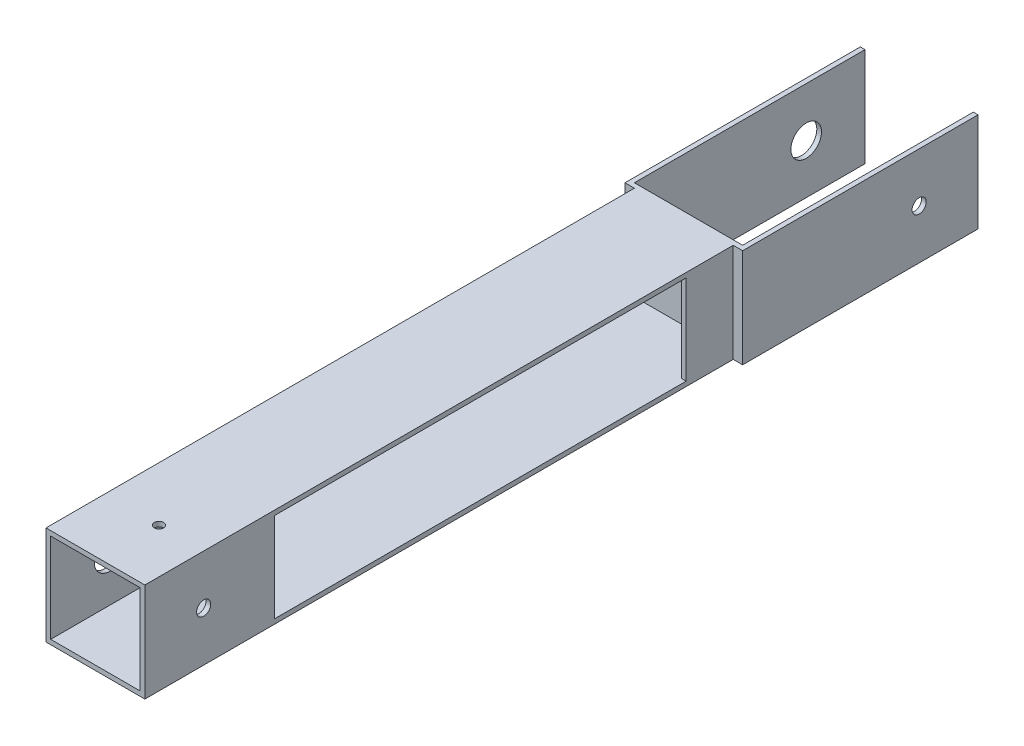
ISO-10303-21;
HEADER;
FILE_DESCRIPTION(('STEP AP214'),'2;1');
FILE_NAME('part.step','',(''),(''),'','','');
FILE_SCHEMA(('AUTOMOTIVE_DESIGN { 1 0 10303 214 1 1 1 1 }'));
ENDSEC;
DATA;
#1=APPLICATION_CONTEXT('core data for automotive mechanical design processes');
#2=APPLICATION_PROTOCOL_DEFINITION('international standard','automotive_design',2000,#1);
#3=PRODUCT_CONTEXT('',#1,'mechanical');
#4=PRODUCT('Part','Part','',(#3));
#5=PRODUCT_RELATED_PRODUCT_CATEGORY('part','',(#4));
#6=PRODUCT_DEFINITION_FORMATION('','',#4);
#7=PRODUCT_DEFINITION_CONTEXT('part definition',#1,'design');
#8=PRODUCT_DEFINITION('design','',#6,#7);
#9=PRODUCT_DEFINITION_SHAPE('','',#8);
#10=(LENGTH_UNIT() NAMED_UNIT(*) SI_UNIT(.MILLI.,.METRE.));
#11=(NAMED_UNIT(*) PLANE_ANGLE_UNIT() SI_UNIT($,.RADIAN.));
#12=(NAMED_UNIT(*) SI_UNIT($,.STERADIAN.) SOLID_ANGLE_UNIT());
#13=UNCERTAINTY_MEASURE_WITH_UNIT(LENGTH_MEASURE(1.E-05),#10,'distance_accuracy_value','');
#14=(GEOMETRIC_REPRESENTATION_CONTEXT(3) GLOBAL_UNCERTAINTY_ASSIGNED_CONTEXT((#13)) GLOBAL_UNIT_ASSIGNED_CONTEXT((#10,
#11,#12)) REPRESENTATION_CONTEXT('',''));
#15=CARTESIAN_POINT('',(0.,0.,0.));
#16=DIRECTION('',(0.,0.,1.));
#17=DIRECTION('',(1.,0.,0.));
#18=AXIS2_PLACEMENT_3D('',#15,#16,#17);
#19=CARTESIAN_POINT('',(19.,-19.,-250.));
#20=DIRECTION('',(1.,0.,0.));
#21=DIRECTION('',(0.,0.,-1.));
#22=AXIS2_PLACEMENT_3D('',#19,#20,#21);
#23=PLANE('',#22);
#24=CARTESIAN_POINT('',(19.,0.,-25.));
#25=DIRECTION('',(1.,0.,0.));
#26=DIRECTION('',(0.,0.,-1.));
#27=AXIS2_PLACEMENT_3D('',#24,#25,#26);
#28=CIRCLE('',#27,3.);
#29=CARTESIAN_POINT('',(19.,0.,-28.));
#30=VERTEX_POINT('',#29);
#31=EDGE_CURVE('E207',#30,#30,#28,.F.);
#32=ORIENTED_EDGE('',*,*,#31,.F.);
#33=EDGE_LOOP('',(#32));
#34=FACE_BOUND('',#33,.T.);
#35=DIRECTION('',(0.,0.,1.));
#36=VECTOR('',#35,1.);
#37=CARTESIAN_POINT('',(19.,19.,-250.));
#38=LINE('',#37,#36);
#39=CARTESIAN_POINT('',(19.,19.,-55.));
#40=VERTEX_POINT('',#39);
#41=CARTESIAN_POINT('',(19.,19.,0.));
#42=VERTEX_POINT('',#41);
#43=EDGE_CURVE('E299',#40,#42,#38,.T.);
#44=ORIENTED_EDGE('',*,*,#43,.F.);
#45=DIRECTION('',(0.,-1.,0.));
#46=VECTOR('',#45,1.);
#47=CARTESIAN_POINT('',(19.,-19.,-55.));
#48=LINE('',#47,#46);
#49=CARTESIAN_POINT('',(19.,-19.,-55.));
#50=VERTEX_POINT('',#49);
#51=EDGE_CURVE('E199',#40,#50,#48,.T.);
#52=ORIENTED_EDGE('',*,*,#51,.T.);
#53=DIRECTION('',(0.,0.,1.));
#54=VECTOR('',#53,1.);
#55=CARTESIAN_POINT('',(19.,-19.,-250.));
#56=LINE('',#55,#54);
#57=CARTESIAN_POINT('',(19.,-19.,0.));
#58=VERTEX_POINT('',#57);
#59=EDGE_CURVE('E313',#50,#58,#56,.T.);
#60=ORIENTED_EDGE('',*,*,#59,.T.);
#61=DIRECTION('',(0.,1.,0.));
#62=VECTOR('',#61,1.);
#63=CARTESIAN_POINT('',(19.,-19.,0.));
#64=LINE('',#63,#62);
#65=EDGE_CURVE('E285',#58,#42,#64,.T.);
#66=ORIENTED_EDGE('',*,*,#65,.T.);
#67=EDGE_LOOP('',(#44,#52,#60,#66));
#68=FACE_BOUND('',#67,.T.);
#69=ADVANCED_FACE('F33',(#34,#68),#23,.F.);
#70=CARTESIAN_POINT('',(21.,-21.0000000000001,-250.));
#71=DIRECTION('',(1.,0.,0.));
#72=DIRECTION('',(0.,0.,-1.));
#73=AXIS2_PLACEMENT_3D('',#70,#71,#72);
#74=PLANE('',#73);
#75=DIRECTION('',(0.,-1.,0.));
#76=VECTOR('',#75,1.);
#77=CARTESIAN_POINT('',(21.,-19.,-55.));
#78=LINE('',#77,#76);
#79=CARTESIAN_POINT('',(21.,19.,-55.));
#80=VERTEX_POINT('',#79);
#81=CARTESIAN_POINT('',(21.,-19.,-55.));
#82=VERTEX_POINT('',#81);
#83=EDGE_CURVE('E50',#80,#82,#78,.T.);
#84=ORIENTED_EDGE('',*,*,#83,.F.);
#85=DIRECTION('',(0.,0.,1.));
#86=VECTOR('',#85,1.);
#87=CARTESIAN_POINT('',(21.,19.,-230.));
#88=LINE('',#87,#86);
#89=CARTESIAN_POINT('',(21.,19.,-230.));
#90=VERTEX_POINT('',#89);
#91=EDGE_CURVE('E189',#90,#80,#88,.T.);
#92=ORIENTED_EDGE('',*,*,#91,.F.);
#93=DIRECTION('',(0.,1.,0.));
#94=VECTOR('',#93,1.);
#95=CARTESIAN_POINT('',(21.,-19.,-230.));
#96=LINE('',#95,#94);
#97=CARTESIAN_POINT('',(21.,-19.,-230.));
#98=VERTEX_POINT('',#97);
#99=EDGE_CURVE('E173',#98,#90,#96,.T.);
#100=ORIENTED_EDGE('',*,*,#99,.F.);
#101=DIRECTION('',(0.,0.,-1.));
#102=VECTOR('',#101,1.);
#103=CARTESIAN_POINT('',(21.,-19.,-230.));
#104=LINE('',#103,#102);
#105=EDGE_CURVE('E182',#82,#98,#104,.T.);
#106=ORIENTED_EDGE('',*,*,#105,.F.);
#107=EDGE_LOOP('',(#84,#92,#100,#106));
#108=FACE_BOUND('',#107,.T.);
#109=CARTESIAN_POINT('',(21.,0.,-25.));
#110=DIRECTION('',(1.,0.,0.));
#111=DIRECTION('',(0.,0.,-1.));
#112=AXIS2_PLACEMENT_3D('',#109,#110,#111);
#113=CIRCLE('',#112,3.);
#114=CARTESIAN_POINT('',(21.,0.,-28.));
#115=VERTEX_POINT('',#114);
#116=EDGE_CURVE('E202',#115,#115,#113,.F.);
#117=ORIENTED_EDGE('',*,*,#116,.T.);
#118=EDGE_LOOP('',(#117));
#119=FACE_BOUND('',#118,.T.);
#120=DIRECTION('',(0.,1.,0.));
#121=VECTOR('',#120,1.);
#122=CARTESIAN_POINT('',(21.,-21.0000000000001,0.));
#123=LINE('',#122,#121);
#124=CARTESIAN_POINT('',(21.,-21.0000000000001,0.));
#125=VERTEX_POINT('',#124);
#126=CARTESIAN_POINT('',(21.,21.0000000000001,0.));
#127=VERTEX_POINT('',#126);
#128=EDGE_CURVE('E312',#125,#127,#123,.T.);
#129=ORIENTED_EDGE('',*,*,#128,.F.);
#130=DIRECTION('',(0.,0.,1.));
#131=VECTOR('',#130,1.);
#132=CARTESIAN_POINT('',(21.,-21.0000000000001,-250.));
#133=LINE('',#132,#131);
#134=CARTESIAN_POINT('',(21.,-21.,-250.));
#135=VERTEX_POINT('',#134);
#136=EDGE_CURVE('E11',#135,#125,#133,.T.);
#137=ORIENTED_EDGE('',*,*,#136,.F.);
#138=DIRECTION('',(0.,1.,0.));
#139=VECTOR('',#138,1.);
#140=CARTESIAN_POINT('',(21.,-21.0000000000001,-250.));
#141=LINE('',#140,#139);
#142=CARTESIAN_POINT('',(21.,21.,-250.));
#143=VERTEX_POINT('',#142);
#144=EDGE_CURVE('E321',#135,#143,#141,.T.);
#145=ORIENTED_EDGE('',*,*,#144,.T.);
#146=DIRECTION('',(0.,0.,1.));
#147=VECTOR('',#146,1.);
#148=CARTESIAN_POINT('',(21.,21.0000000000001,-250.));
#149=LINE('',#148,#147);
#150=EDGE_CURVE('E328',#143,#127,#149,.T.);
#151=ORIENTED_EDGE('',*,*,#150,.T.);
#152=EDGE_LOOP('',(#129,#137,#145,#151));
#153=FACE_BOUND('',#152,.T.);
#154=ADVANCED_FACE('F35',(#108,#119,#153),#74,.T.);
#155=CARTESIAN_POINT('',(-21.,-21.0000000000001,-250.));
#156=DIRECTION('',(0.,-1.,0.));
#157=DIRECTION('',(0.,0.,-1.));
#158=AXIS2_PLACEMENT_3D('',#155,#156,#157);
#159=PLANE('',#158);
#160=CARTESIAN_POINT('',(2.,-21.0000000000001,-25.));
#161=DIRECTION('',(0.,1.,0.));
#162=DIRECTION('',(0.,0.,1.));
#163=AXIS2_PLACEMENT_3D('',#160,#161,#162);
#164=CIRCLE('',#163,2.);
#165=CARTESIAN_POINT('',(2.,-21.0000000000001,-23.));
#166=VERTEX_POINT('',#165);
#167=EDGE_CURVE('E454',#166,#166,#164,.T.);
#168=ORIENTED_EDGE('',*,*,#167,.T.);
#169=EDGE_LOOP('',(#168));
#170=FACE_BOUND('',#169,.T.);
#171=DIRECTION('',(1.,0.,0.));
#172=VECTOR('',#171,1.);
#173=CARTESIAN_POINT('',(-21.,-21.0000000000001,0.));
#174=LINE('',#173,#172);
#175=CARTESIAN_POINT('',(-21.,-21.0000000000001,0.));
#176=VERTEX_POINT('',#175);
#177=EDGE_CURVE('E325',#176,#125,#174,.T.);
#178=ORIENTED_EDGE('',*,*,#177,.F.);
#179=DIRECTION('',(0.,0.,1.));
#180=VECTOR('',#179,1.);
#181=CARTESIAN_POINT('',(-21.,-21.0000000000001,-250.));
#182=LINE('',#181,#180);
#183=CARTESIAN_POINT('',(-21.,-21.0000000000001,-250.));
#184=VERTEX_POINT('',#183);
#185=EDGE_CURVE('E42',#184,#176,#182,.T.);
#186=ORIENTED_EDGE('',*,*,#185,.F.);
#187=DIRECTION('',(1.,0.,0.));
#188=VECTOR('',#187,1.);
#189=CARTESIAN_POINT('',(25.,-21.,-250.));
#190=LINE('',#189,#188);
#191=CARTESIAN_POINT('',(-25.,-21.,-250.));
#192=VERTEX_POINT('',#191);
#193=EDGE_CURVE('E246',#192,#184,#190,.T.);
#194=ORIENTED_EDGE('',*,*,#193,.F.);
#195=DIRECTION('',(0.,0.,1.));
#196=VECTOR('',#195,1.);
#197=CARTESIAN_POINT('',(-25.,-21.,-250.));
#198=LINE('',#197,#196);
#199=CARTESIAN_POINT('',(-25.,-21.,-350.));
#200=VERTEX_POINT('',#199);
#201=EDGE_CURVE('E260',#200,#192,#198,.T.);
#202=ORIENTED_EDGE('',*,*,#201,.F.);
#203=DIRECTION('',(-1.,0.,0.));
#204=VECTOR('',#203,1.);
#205=CARTESIAN_POINT('',(-25.,-21.,-350.));
#206=LINE('',#205,#204);
#207=CARTESIAN_POINT('',(-23.,-21.,-350.));
#208=VERTEX_POINT('',#207);
#209=EDGE_CURVE('E258',#208,#200,#206,.T.);
#210=ORIENTED_EDGE('',*,*,#209,.F.);
#211=DIRECTION('',(0.,0.,-1.));
#212=VECTOR('',#211,1.);
#213=CARTESIAN_POINT('',(-23.,-21.,-350.));
#214=LINE('',#213,#212);
#215=CARTESIAN_POINT('',(-23.,-21.,-252.));
#216=VERTEX_POINT('',#215);
#217=EDGE_CURVE('E256',#216,#208,#214,.T.);
#218=ORIENTED_EDGE('',*,*,#217,.F.);
#219=DIRECTION('',(-1.,0.,0.));
#220=VECTOR('',#219,1.);
#221=CARTESIAN_POINT('',(-23.,-21.,-252.));
#222=LINE('',#221,#220);
#223=CARTESIAN_POINT('',(23.,-21.,-252.));
#224=VERTEX_POINT('',#223);
#225=EDGE_CURVE('E254',#224,#216,#222,.T.);
#226=ORIENTED_EDGE('',*,*,#225,.F.);
#227=DIRECTION('',(0.,0.,1.));
#228=VECTOR('',#227,1.);
#229=CARTESIAN_POINT('',(23.,-21.,-252.));
#230=LINE('',#229,#228);
#231=CARTESIAN_POINT('',(23.,-21.,-350.));
#232=VERTEX_POINT('',#231);
#233=EDGE_CURVE('E252',#232,#224,#230,.T.);
#234=ORIENTED_EDGE('',*,*,#233,.F.);
#235=DIRECTION('',(-1.,0.,0.));
#236=VECTOR('',#235,1.);
#237=CARTESIAN_POINT('',(23.,-21.,-350.));
#238=LINE('',#237,#236);
#239=CARTESIAN_POINT('',(25.,-21.,-350.));
#240=VERTEX_POINT('',#239);
#241=EDGE_CURVE('E250',#240,#232,#238,.T.);
#242=ORIENTED_EDGE('',*,*,#241,.F.);
#243=DIRECTION('',(0.,0.,-1.));
#244=VECTOR('',#243,1.);
#245=CARTESIAN_POINT('',(25.,-21.,-350.));
#246=LINE('',#245,#244);
#247=CARTESIAN_POINT('',(25.,-21.,-250.));
#248=VERTEX_POINT('',#247);
#249=EDGE_CURVE('E248',#248,#240,#246,.T.);
#250=ORIENTED_EDGE('',*,*,#249,.F.);
#251=EDGE_CURVE('E218',#135,#248,#190,.T.);
#252=ORIENTED_EDGE('',*,*,#251,.F.);
#253=ORIENTED_EDGE('',*,*,#136,.T.);
#254=EDGE_LOOP('',(#178,#186,#194,#202,#210,#218,#226,#234,#242,#250,#252,#253));
#255=FACE_BOUND('',#254,.T.);
#256=ADVANCED_FACE('F355',(#170,#255),#159,.T.);
#257=CARTESIAN_POINT('',(-21.,-21.0000000000001,-250.));
#258=DIRECTION('',(-1.,0.,0.));
#259=DIRECTION('',(0.,0.,1.));
#260=AXIS2_PLACEMENT_3D('',#257,#258,#259);
#261=PLANE('',#260);
#262=CARTESIAN_POINT('',(-21.,0.,-25.));
#263=DIRECTION('',(-1.,0.,0.));
#264=DIRECTION('',(0.,0.,1.));
#265=AXIS2_PLACEMENT_3D('',#262,#263,#264);
#266=CIRCLE('',#265,6.5);
#267=CARTESIAN_POINT('',(-21.,0.,-18.5));
#268=VERTEX_POINT('',#267);
#269=EDGE_CURVE('E215',#268,#268,#266,.F.);
#270=ORIENTED_EDGE('',*,*,#269,.T.);
#271=EDGE_LOOP('',(#270));
#272=FACE_BOUND('',#271,.T.);
#273=DIRECTION('',(0.,-1.,0.));
#274=VECTOR('',#273,1.);
#275=CARTESIAN_POINT('',(-21.,-21.0000000000001,0.));
#276=LINE('',#275,#274);
#277=CARTESIAN_POINT('',(-21.,21.0000000000001,0.));
#278=VERTEX_POINT('',#277);
#279=EDGE_CURVE('E334',#278,#176,#276,.T.);
#280=ORIENTED_EDGE('',*,*,#279,.F.);
#281=DIRECTION('',(0.,0.,1.));
#282=VECTOR('',#281,1.);
#283=CARTESIAN_POINT('',(-21.,21.0000000000001,-250.));
#284=LINE('',#283,#282);
#285=CARTESIAN_POINT('',(-21.,21.,-250.));
#286=VERTEX_POINT('',#285);
#287=EDGE_CURVE('E340',#286,#278,#284,.T.);
#288=ORIENTED_EDGE('',*,*,#287,.F.);
#289=DIRECTION('',(0.,-1.,0.));
#290=VECTOR('',#289,1.);
#291=CARTESIAN_POINT('',(-21.,-21.0000000000001,-250.));
#292=LINE('',#291,#290);
#293=EDGE_CURVE('E324',#286,#184,#292,.T.);
#294=ORIENTED_EDGE('',*,*,#293,.T.);
#295=ORIENTED_EDGE('',*,*,#185,.T.);
#296=EDGE_LOOP('',(#280,#288,#294,#295));
#297=FACE_BOUND('',#296,.T.);
#298=ADVANCED_FACE('F400',(#272,#297),#261,.T.);
#299=CARTESIAN_POINT('',(-21.,21.0000000000001,-250.));
#300=DIRECTION('',(0.,1.,0.));
#301=DIRECTION('',(0.,0.,1.));
#302=AXIS2_PLACEMENT_3D('',#299,#300,#301);
#303=PLANE('',#302);
#304=CARTESIAN_POINT('',(2.,21.0000000000001,-25.));
#305=DIRECTION('',(0.,1.,0.));
#306=DIRECTION('',(0.,0.,1.));
#307=AXIS2_PLACEMENT_3D('',#304,#305,#306);
#308=CIRCLE('',#307,2.);
#309=CARTESIAN_POINT('',(2.,21.0000000000001,-23.));
#310=VERTEX_POINT('',#309);
#311=EDGE_CURVE('E451',#310,#310,#308,.T.);
#312=ORIENTED_EDGE('',*,*,#311,.F.);
#313=EDGE_LOOP('',(#312));
#314=FACE_BOUND('',#313,.T.);
#315=DIRECTION('',(-1.,0.,0.));
#316=VECTOR('',#315,1.);
#317=CARTESIAN_POINT('',(-21.,21.0000000000001,0.));
#318=LINE('',#317,#316);
#319=EDGE_CURVE('E331',#127,#278,#318,.T.);
#320=ORIENTED_EDGE('',*,*,#319,.F.);
#321=ORIENTED_EDGE('',*,*,#150,.F.);
#322=DIRECTION('',(1.,0.,0.));
#323=VECTOR('',#322,1.);
#324=CARTESIAN_POINT('',(25.,21.,-250.));
#325=LINE('',#324,#323);
#326=CARTESIAN_POINT('',(25.,21.,-250.));
#327=VERTEX_POINT('',#326);
#328=EDGE_CURVE('E231',#143,#327,#325,.T.);
#329=ORIENTED_EDGE('',*,*,#328,.T.);
#330=DIRECTION('',(0.,0.,-1.));
#331=VECTOR('',#330,1.);
#332=CARTESIAN_POINT('',(25.,21.,-350.));
#333=LINE('',#332,#331);
#334=CARTESIAN_POINT('',(25.,21.,-350.));
#335=VERTEX_POINT('',#334);
#336=EDGE_CURVE('E230',#327,#335,#333,.T.);
#337=ORIENTED_EDGE('',*,*,#336,.T.);
#338=DIRECTION('',(-1.,0.,0.));
#339=VECTOR('',#338,1.);
#340=CARTESIAN_POINT('',(23.,21.,-350.));
#341=LINE('',#340,#339);
#342=CARTESIAN_POINT('',(23.,21.,-350.));
#343=VERTEX_POINT('',#342);
#344=EDGE_CURVE('E233',#335,#343,#341,.T.);
#345=ORIENTED_EDGE('',*,*,#344,.T.);
#346=DIRECTION('',(0.,0.,1.));
#347=VECTOR('',#346,1.);
#348=CARTESIAN_POINT('',(23.,21.,-252.));
#349=LINE('',#348,#347);
#350=CARTESIAN_POINT('',(23.,21.,-252.));
#351=VERTEX_POINT('',#350);
#352=EDGE_CURVE('E235',#343,#351,#349,.T.);
#353=ORIENTED_EDGE('',*,*,#352,.T.);
#354=DIRECTION('',(-1.,0.,0.));
#355=VECTOR('',#354,1.);
#356=CARTESIAN_POINT('',(-23.,21.,-252.));
#357=LINE('',#356,#355);
#358=CARTESIAN_POINT('',(-23.,21.,-252.));
#359=VERTEX_POINT('',#358);
#360=EDGE_CURVE('E237',#351,#359,#357,.T.);
#361=ORIENTED_EDGE('',*,*,#360,.T.);
#362=DIRECTION('',(0.,0.,-1.));
#363=VECTOR('',#362,1.);
#364=CARTESIAN_POINT('',(-23.,21.,-350.));
#365=LINE('',#364,#363);
#366=CARTESIAN_POINT('',(-23.,21.,-350.));
#367=VERTEX_POINT('',#366);
#368=EDGE_CURVE('E239',#359,#367,#365,.T.);
#369=ORIENTED_EDGE('',*,*,#368,.T.);
#370=DIRECTION('',(-1.,0.,0.));
#371=VECTOR('',#370,1.);
#372=CARTESIAN_POINT('',(-25.,21.,-350.));
#373=LINE('',#372,#371);
#374=CARTESIAN_POINT('',(-25.,21.,-350.));
#375=VERTEX_POINT('',#374);
#376=EDGE_CURVE('E241',#367,#375,#373,.T.);
#377=ORIENTED_EDGE('',*,*,#376,.T.);
#378=DIRECTION('',(0.,0.,1.));
#379=VECTOR('',#378,1.);
#380=CARTESIAN_POINT('',(-25.,21.,-250.));
#381=LINE('',#380,#379);
#382=CARTESIAN_POINT('',(-25.,21.,-250.));
#383=VERTEX_POINT('',#382);
#384=EDGE_CURVE('E243',#375,#383,#381,.T.);
#385=ORIENTED_EDGE('',*,*,#384,.T.);
#386=EDGE_CURVE('E227',#383,#286,#325,.T.);
#387=ORIENTED_EDGE('',*,*,#386,.T.);
#388=ORIENTED_EDGE('',*,*,#287,.T.);
#389=EDGE_LOOP('',(#320,#321,#329,#337,#345,#353,#361,#369,#377,#385,#387,#388));
#390=FACE_BOUND('',#389,.T.);
#391=ADVANCED_FACE('F347',(#314,#390),#303,.T.);
#392=CARTESIAN_POINT('',(0.,0.,0.));
#393=DIRECTION('',(0.,0.,-1.));
#394=DIRECTION('',(-1.,0.,0.));
#395=AXIS2_PLACEMENT_3D('',#392,#393,#394);
#396=PLANE('',#395);
#397=DIRECTION('',(-1.,0.,0.));
#398=VECTOR('',#397,1.);
#399=CARTESIAN_POINT('',(-19.,19.,0.));
#400=LINE('',#399,#398);
#401=CARTESIAN_POINT('',(-19.,19.,0.));
#402=VERTEX_POINT('',#401);
#403=EDGE_CURVE('E302',#42,#402,#400,.T.);
#404=ORIENTED_EDGE('',*,*,#403,.F.);
#405=ORIENTED_EDGE('',*,*,#65,.F.);
#406=DIRECTION('',(1.,0.,0.));
#407=VECTOR('',#406,1.);
#408=CARTESIAN_POINT('',(-19.,-19.,0.));
#409=LINE('',#408,#407);
#410=CARTESIAN_POINT('',(-19.,-19.,0.));
#411=VERTEX_POINT('',#410);
#412=EDGE_CURVE('E290',#411,#58,#409,.T.);
#413=ORIENTED_EDGE('',*,*,#412,.F.);
#414=DIRECTION('',(0.,-1.,0.));
#415=VECTOR('',#414,1.);
#416=CARTESIAN_POINT('',(-19.,-19.,0.));
#417=LINE('',#416,#415);
#418=EDGE_CURVE('E305',#402,#411,#417,.T.);
#419=ORIENTED_EDGE('',*,*,#418,.F.);
#420=EDGE_LOOP('',(#404,#405,#413,#419));
#421=FACE_BOUND('',#420,.T.);
#422=ORIENTED_EDGE('',*,*,#128,.T.);
#423=ORIENTED_EDGE('',*,*,#319,.T.);
#424=ORIENTED_EDGE('',*,*,#279,.T.);
#425=ORIENTED_EDGE('',*,*,#177,.T.);
#426=EDGE_LOOP('',(#422,#423,#424,#425));
#427=FACE_BOUND('',#426,.T.);
#428=ADVANCED_FACE('F351',(#421,#427),#396,.F.);
#429=CARTESIAN_POINT('',(19.,-19.,-250.));
#430=VERTEX_POINT('',#429);
#431=CARTESIAN_POINT('',(19.,-19.,-230.));
#432=VERTEX_POINT('',#431);
#433=EDGE_CURVE('E310',#430,#432,#56,.T.);
#434=ORIENTED_EDGE('',*,*,#433,.T.);
#435=DIRECTION('',(0.,1.,0.));
#436=VECTOR('',#435,1.);
#437=CARTESIAN_POINT('',(19.,-19.,-230.));
#438=LINE('',#437,#436);
#439=CARTESIAN_POINT('',(19.,19.,-230.));
#440=VERTEX_POINT('',#439);
#441=EDGE_CURVE('E176',#432,#440,#438,.T.);
#442=ORIENTED_EDGE('',*,*,#441,.T.);
#443=CARTESIAN_POINT('',(19.,19.,-250.));
#444=VERTEX_POINT('',#443);
#445=EDGE_CURVE('E318',#444,#440,#38,.T.);
#446=ORIENTED_EDGE('',*,*,#445,.F.);
#447=DIRECTION('',(0.,1.,0.));
#448=VECTOR('',#447,1.);
#449=CARTESIAN_POINT('',(19.,-19.,-250.));
#450=LINE('',#449,#448);
#451=EDGE_CURVE('E286',#430,#444,#450,.T.);
#452=ORIENTED_EDGE('',*,*,#451,.F.);
#453=EDGE_LOOP('',(#434,#442,#446,#452));
#454=FACE_BOUND('',#453,.T.);
#455=ADVANCED_FACE('F414',(#454),#23,.F.);
#456=CARTESIAN_POINT('',(-19.,-19.,-250.));
#457=DIRECTION('',(0.,-1.,0.));
#458=DIRECTION('',(0.,0.,-1.));
#459=AXIS2_PLACEMENT_3D('',#456,#457,#458);
#460=PLANE('',#459);
#461=CARTESIAN_POINT('',(2.,-19.,-25.));
#462=DIRECTION('',(0.,-1.,0.));
#463=DIRECTION('',(0.,0.,-1.));
#464=AXIS2_PLACEMENT_3D('',#461,#462,#463);
#465=CIRCLE('',#464,2.);
#466=CARTESIAN_POINT('',(2.,-19.,-27.));
#467=VERTEX_POINT('',#466);
#468=EDGE_CURVE('E447',#467,#467,#465,.T.);
#469=ORIENTED_EDGE('',*,*,#468,.T.);
#470=EDGE_LOOP('',(#469));
#471=FACE_BOUND('',#470,.T.);
#472=ORIENTED_EDGE('',*,*,#59,.F.);
#473=DIRECTION('',(1.,0.,0.));
#474=VECTOR('',#473,1.);
#475=CARTESIAN_POINT('',(11.,-19.,-55.));
#476=LINE('',#475,#474);
#477=EDGE_CURVE('E179',#50,#82,#476,.T.);
#478=ORIENTED_EDGE('',*,*,#477,.T.);
#479=ORIENTED_EDGE('',*,*,#105,.T.);
#480=DIRECTION('',(1.,0.,0.));
#481=VECTOR('',#480,1.);
#482=CARTESIAN_POINT('',(11.,-19.,-230.));
#483=LINE('',#482,#481);
#484=EDGE_CURVE('E58',#432,#98,#483,.T.);
#485=ORIENTED_EDGE('',*,*,#484,.F.);
#486=ORIENTED_EDGE('',*,*,#433,.F.);
#487=DIRECTION('',(1.,0.,0.));
#488=VECTOR('',#487,1.);
#489=CARTESIAN_POINT('',(-19.,-19.,-250.));
#490=LINE('',#489,#488);
#491=CARTESIAN_POINT('',(-19.,-19.,-250.));
#492=VERTEX_POINT('',#491);
#493=EDGE_CURVE('E296',#492,#430,#490,.T.);
#494=ORIENTED_EDGE('',*,*,#493,.F.);
#495=DIRECTION('',(0.,0.,1.));
#496=VECTOR('',#495,1.);
#497=CARTESIAN_POINT('',(-19.,-19.,-250.));
#498=LINE('',#497,#496);
#499=EDGE_CURVE('E314',#492,#411,#498,.T.);
#500=ORIENTED_EDGE('',*,*,#499,.T.);
#501=ORIENTED_EDGE('',*,*,#412,.T.);
#502=EDGE_LOOP('',(#472,#478,#479,#485,#486,#494,#500,#501));
#503=FACE_BOUND('',#502,.T.);
#504=ADVANCED_FACE('F184',(#471,#503),#460,.F.);
#505=CARTESIAN_POINT('',(-19.,-19.,-250.));
#506=DIRECTION('',(-1.,0.,0.));
#507=DIRECTION('',(0.,0.,1.));
#508=AXIS2_PLACEMENT_3D('',#505,#506,#507);
#509=PLANE('',#508);
#510=CARTESIAN_POINT('',(-19.,0.,-25.));
#511=DIRECTION('',(-1.,0.,0.));
#512=DIRECTION('',(0.,0.,1.));
#513=AXIS2_PLACEMENT_3D('',#510,#511,#512);
#514=CIRCLE('',#513,6.5);
#515=CARTESIAN_POINT('',(-19.,0.,-18.5));
#516=VERTEX_POINT('',#515);
#517=EDGE_CURVE('E219',#516,#516,#514,.F.);
#518=ORIENTED_EDGE('',*,*,#517,.F.);
#519=EDGE_LOOP('',(#518));
#520=FACE_BOUND('',#519,.T.);
#521=ORIENTED_EDGE('',*,*,#418,.T.);
#522=ORIENTED_EDGE('',*,*,#499,.F.);
#523=DIRECTION('',(0.,-1.,0.));
#524=VECTOR('',#523,1.);
#525=CARTESIAN_POINT('',(-19.,-19.,-250.));
#526=LINE('',#525,#524);
#527=CARTESIAN_POINT('',(-19.,19.,-250.));
#528=VERTEX_POINT('',#527);
#529=EDGE_CURVE('E293',#528,#492,#526,.T.);
#530=ORIENTED_EDGE('',*,*,#529,.F.);
#531=DIRECTION('',(0.,0.,1.));
#532=VECTOR('',#531,1.);
#533=CARTESIAN_POINT('',(-19.,19.,-250.));
#534=LINE('',#533,#532);
#535=EDGE_CURVE('E316',#528,#402,#534,.T.);
#536=ORIENTED_EDGE('',*,*,#535,.T.);
#537=EDGE_LOOP('',(#521,#522,#530,#536));
#538=FACE_BOUND('',#537,.T.);
#539=ADVANCED_FACE('F428',(#520,#538),#509,.F.);
#540=CARTESIAN_POINT('',(-19.,19.,-250.));
#541=DIRECTION('',(0.,1.,0.));
#542=DIRECTION('',(0.,0.,1.));
#543=AXIS2_PLACEMENT_3D('',#540,#541,#542);
#544=PLANE('',#543);
#545=CARTESIAN_POINT('',(2.,19.,-25.));
#546=DIRECTION('',(0.,1.,0.));
#547=DIRECTION('',(0.,0.,1.));
#548=AXIS2_PLACEMENT_3D('',#545,#546,#547);
#549=CIRCLE('',#548,2.);
#550=CARTESIAN_POINT('',(2.,19.,-23.));
#551=VERTEX_POINT('',#550);
#552=EDGE_CURVE('E37',#551,#551,#549,.T.);
#553=ORIENTED_EDGE('',*,*,#552,.T.);
#554=EDGE_LOOP('',(#553));
#555=FACE_BOUND('',#554,.T.);
#556=ORIENTED_EDGE('',*,*,#445,.T.);
#557=DIRECTION('',(1.,0.,0.));
#558=VECTOR('',#557,1.);
#559=CARTESIAN_POINT('',(11.,19.,-230.));
#560=LINE('',#559,#558);
#561=EDGE_CURVE('E178',#440,#90,#560,.T.);
#562=ORIENTED_EDGE('',*,*,#561,.T.);
#563=ORIENTED_EDGE('',*,*,#91,.T.);
#564=DIRECTION('',(1.,0.,0.));
#565=VECTOR('',#564,1.);
#566=CARTESIAN_POINT('',(11.,19.,-55.));
#567=LINE('',#566,#565);
#568=EDGE_CURVE('E194',#40,#80,#567,.T.);
#569=ORIENTED_EDGE('',*,*,#568,.F.);
#570=ORIENTED_EDGE('',*,*,#43,.T.);
#571=ORIENTED_EDGE('',*,*,#403,.T.);
#572=ORIENTED_EDGE('',*,*,#535,.F.);
#573=DIRECTION('',(-1.,0.,0.));
#574=VECTOR('',#573,1.);
#575=CARTESIAN_POINT('',(-19.,19.,-250.));
#576=LINE('',#575,#574);
#577=EDGE_CURVE('E289',#444,#528,#576,.T.);
#578=ORIENTED_EDGE('',*,*,#577,.F.);
#579=EDGE_LOOP('',(#556,#562,#563,#569,#570,#571,#572,#578));
#580=FACE_BOUND('',#579,.T.);
#581=ADVANCED_FACE('F439',(#555,#580),#544,.F.);
#582=CARTESIAN_POINT('',(-25.,21.,-250.));
#583=DIRECTION('',(1.,0.,0.));
#584=DIRECTION('',(0.,0.,-1.));
#585=AXIS2_PLACEMENT_3D('',#582,#583,#584);
#586=PLANE('',#585);
#587=CARTESIAN_POINT('',(-25.,0.,-325.));
#588=DIRECTION('',(-1.,0.,0.));
#589=DIRECTION('',(0.,0.,1.));
#590=AXIS2_PLACEMENT_3D('',#587,#588,#589);
#591=CIRCLE('',#590,6.50000000000002);
#592=CARTESIAN_POINT('',(-25.,0.,-318.5));
#593=VERTEX_POINT('',#592);
#594=EDGE_CURVE('E210',#593,#593,#591,.T.);
#595=ORIENTED_EDGE('',*,*,#594,.F.);
#596=EDGE_LOOP('',(#595));
#597=FACE_BOUND('',#596,.T.);
#598=ORIENTED_EDGE('',*,*,#201,.T.);
#599=DIRECTION('',(0.,-1.,0.));
#600=VECTOR('',#599,1.);
#601=CARTESIAN_POINT('',(-25.,21.,-250.));
#602=LINE('',#601,#600);
#603=EDGE_CURVE('E245',#383,#192,#602,.T.);
#604=ORIENTED_EDGE('',*,*,#603,.F.);
#605=ORIENTED_EDGE('',*,*,#384,.F.);
#606=DIRECTION('',(0.,-1.,0.));
#607=VECTOR('',#606,1.);
#608=CARTESIAN_POINT('',(-25.,21.,-350.));
#609=LINE('',#608,#607);
#610=EDGE_CURVE('E264',#375,#200,#609,.T.);
#611=ORIENTED_EDGE('',*,*,#610,.T.);
#612=EDGE_LOOP('',(#598,#604,#605,#611));
#613=FACE_BOUND('',#612,.T.);
#614=ADVANCED_FACE('F395',(#597,#613),#586,.F.);
#615=CARTESIAN_POINT('',(-25.,21.,-350.));
#616=DIRECTION('',(0.,0.,1.));
#617=DIRECTION('',(1.,0.,0.));
#618=AXIS2_PLACEMENT_3D('',#615,#616,#617);
#619=PLANE('',#618);
#620=ORIENTED_EDGE('',*,*,#209,.T.);
#621=ORIENTED_EDGE('',*,*,#610,.F.);
#622=ORIENTED_EDGE('',*,*,#376,.F.);
#623=DIRECTION('',(0.,-1.,0.));
#624=VECTOR('',#623,1.);
#625=CARTESIAN_POINT('',(-23.,21.,-350.));
#626=LINE('',#625,#624);
#627=EDGE_CURVE('E267',#367,#208,#626,.T.);
#628=ORIENTED_EDGE('',*,*,#627,.T.);
#629=EDGE_LOOP('',(#620,#621,#622,#628));
#630=FACE_BOUND('',#629,.T.);
#631=ADVANCED_FACE('F391',(#630),#619,.F.);
#632=CARTESIAN_POINT('',(-23.,21.,-350.));
#633=DIRECTION('',(-1.,0.,0.));
#634=DIRECTION('',(0.,0.,1.));
#635=AXIS2_PLACEMENT_3D('',#632,#633,#634);
#636=PLANE('',#635);
#637=CARTESIAN_POINT('',(-23.,0.,-325.));
#638=DIRECTION('',(-1.,0.,0.));
#639=DIRECTION('',(0.,0.,1.));
#640=AXIS2_PLACEMENT_3D('',#637,#638,#639);
#641=CIRCLE('',#640,6.50000000000002);
#642=CARTESIAN_POINT('',(-23.,0.,-318.5));
#643=VERTEX_POINT('',#642);
#644=EDGE_CURVE('E222',#643,#643,#641,.F.);
#645=ORIENTED_EDGE('',*,*,#644,.F.);
#646=EDGE_LOOP('',(#645));
#647=FACE_BOUND('',#646,.T.);
#648=ORIENTED_EDGE('',*,*,#217,.T.);
#649=ORIENTED_EDGE('',*,*,#627,.F.);
#650=ORIENTED_EDGE('',*,*,#368,.F.);
#651=DIRECTION('',(0.,-1.,0.));
#652=VECTOR('',#651,1.);
#653=CARTESIAN_POINT('',(-23.,21.,-252.));
#654=LINE('',#653,#652);
#655=EDGE_CURVE('E270',#359,#216,#654,.T.);
#656=ORIENTED_EDGE('',*,*,#655,.T.);
#657=EDGE_LOOP('',(#648,#649,#650,#656));
#658=FACE_BOUND('',#657,.T.);
#659=ADVANCED_FACE('F385',(#647,#658),#636,.F.);
#660=CARTESIAN_POINT('',(-23.,21.,-252.));
#661=DIRECTION('',(0.,0.,1.));
#662=DIRECTION('',(1.,0.,0.));
#663=AXIS2_PLACEMENT_3D('',#660,#661,#662);
#664=PLANE('',#663);
#665=ORIENTED_EDGE('',*,*,#225,.T.);
#666=ORIENTED_EDGE('',*,*,#655,.F.);
#667=ORIENTED_EDGE('',*,*,#360,.F.);
#668=DIRECTION('',(0.,-1.,0.));
#669=VECTOR('',#668,1.);
#670=CARTESIAN_POINT('',(23.,21.,-252.));
#671=LINE('',#670,#669);
#672=EDGE_CURVE('E273',#351,#224,#671,.T.);
#673=ORIENTED_EDGE('',*,*,#672,.T.);
#674=EDGE_LOOP('',(#665,#666,#667,#673));
#675=FACE_BOUND('',#674,.T.);
#676=ADVANCED_FACE('F380',(#675),#664,.F.);
#677=CARTESIAN_POINT('',(23.,21.,-252.));
#678=DIRECTION('',(1.,0.,0.));
#679=DIRECTION('',(0.,0.,-1.));
#680=AXIS2_PLACEMENT_3D('',#677,#678,#679);
#681=PLANE('',#680);
#682=CARTESIAN_POINT('',(23.,0.,-325.));
#683=DIRECTION('',(1.,0.,0.));
#684=DIRECTION('',(0.,0.,-1.));
#685=AXIS2_PLACEMENT_3D('',#682,#683,#684);
#686=CIRCLE('',#685,2.99999999999999);
#687=CARTESIAN_POINT('',(23.,0.,-328.));
#688=VERTEX_POINT('',#687);
#689=EDGE_CURVE('E206',#688,#688,#686,.F.);
#690=ORIENTED_EDGE('',*,*,#689,.F.);
#691=EDGE_LOOP('',(#690));
#692=FACE_BOUND('',#691,.T.);
#693=ORIENTED_EDGE('',*,*,#233,.T.);
#694=ORIENTED_EDGE('',*,*,#672,.F.);
#695=ORIENTED_EDGE('',*,*,#352,.F.);
#696=DIRECTION('',(0.,-1.,0.));
#697=VECTOR('',#696,1.);
#698=CARTESIAN_POINT('',(23.,21.,-350.));
#699=LINE('',#698,#697);
#700=EDGE_CURVE('E276',#343,#232,#699,.T.);
#701=ORIENTED_EDGE('',*,*,#700,.T.);
#702=EDGE_LOOP('',(#693,#694,#695,#701));
#703=FACE_BOUND('',#702,.T.);
#704=ADVANCED_FACE('F376',(#692,#703),#681,.F.);
#705=CARTESIAN_POINT('',(23.,21.,-350.));
#706=DIRECTION('',(0.,0.,1.));
#707=DIRECTION('',(1.,0.,0.));
#708=AXIS2_PLACEMENT_3D('',#705,#706,#707);
#709=PLANE('',#708);
#710=ORIENTED_EDGE('',*,*,#241,.T.);
#711=ORIENTED_EDGE('',*,*,#700,.F.);
#712=ORIENTED_EDGE('',*,*,#344,.F.);
#713=DIRECTION('',(0.,-1.,0.));
#714=VECTOR('',#713,1.);
#715=CARTESIAN_POINT('',(25.,21.,-350.));
#716=LINE('',#715,#714);
#717=EDGE_CURVE('E279',#335,#240,#716,.T.);
#718=ORIENTED_EDGE('',*,*,#717,.T.);
#719=EDGE_LOOP('',(#710,#711,#712,#718));
#720=FACE_BOUND('',#719,.T.);
#721=ADVANCED_FACE('F370',(#720),#709,.F.);
#722=CARTESIAN_POINT('',(25.,21.,-350.));
#723=DIRECTION('',(-1.,0.,0.));
#724=DIRECTION('',(0.,0.,1.));
#725=AXIS2_PLACEMENT_3D('',#722,#723,#724);
#726=PLANE('',#725);
#727=CARTESIAN_POINT('',(25.,0.,-325.));
#728=DIRECTION('',(1.,0.,0.));
#729=DIRECTION('',(0.,0.,-1.));
#730=AXIS2_PLACEMENT_3D('',#727,#728,#729);
#731=CIRCLE('',#730,2.99999999999999);
#732=CARTESIAN_POINT('',(25.,0.,-328.));
#733=VERTEX_POINT('',#732);
#734=EDGE_CURVE('E203',#733,#733,#731,.T.);
#735=ORIENTED_EDGE('',*,*,#734,.F.);
#736=EDGE_LOOP('',(#735));
#737=FACE_BOUND('',#736,.T.);
#738=ORIENTED_EDGE('',*,*,#249,.T.);
#739=ORIENTED_EDGE('',*,*,#717,.F.);
#740=ORIENTED_EDGE('',*,*,#336,.F.);
#741=DIRECTION('',(0.,-1.,0.));
#742=VECTOR('',#741,1.);
#743=CARTESIAN_POINT('',(25.,21.,-250.));
#744=LINE('',#743,#742);
#745=EDGE_CURVE('E282',#327,#248,#744,.T.);
#746=ORIENTED_EDGE('',*,*,#745,.T.);
#747=EDGE_LOOP('',(#738,#739,#740,#746));
#748=FACE_BOUND('',#747,.T.);
#749=ADVANCED_FACE('F366',(#737,#748),#726,.F.);
#750=CARTESIAN_POINT('',(25.,21.,-250.));
#751=DIRECTION('',(0.,0.,-1.));
#752=DIRECTION('',(-1.,0.,0.));
#753=AXIS2_PLACEMENT_3D('',#750,#751,#752);
#754=PLANE('',#753);
#755=ORIENTED_EDGE('',*,*,#293,.F.);
#756=ORIENTED_EDGE('',*,*,#386,.F.);
#757=ORIENTED_EDGE('',*,*,#603,.T.);
#758=ORIENTED_EDGE('',*,*,#193,.T.);
#759=EDGE_LOOP('',(#755,#756,#757,#758));
#760=FACE_BOUND('',#759,.T.);
#761=ADVANCED_FACE('F398',(#760),#754,.F.);
#762=ORIENTED_EDGE('',*,*,#144,.F.);
#763=ORIENTED_EDGE('',*,*,#251,.T.);
#764=ORIENTED_EDGE('',*,*,#745,.F.);
#765=ORIENTED_EDGE('',*,*,#328,.F.);
#766=EDGE_LOOP('',(#762,#763,#764,#765));
#767=FACE_BOUND('',#766,.T.);
#768=ADVANCED_FACE('F362',(#767),#754,.F.);
#769=ORIENTED_EDGE('',*,*,#493,.T.);
#770=ORIENTED_EDGE('',*,*,#451,.T.);
#771=ORIENTED_EDGE('',*,*,#577,.T.);
#772=ORIENTED_EDGE('',*,*,#529,.T.);
#773=EDGE_LOOP('',(#769,#770,#771,#772));
#774=FACE_BOUND('',#773,.T.);
#775=ADVANCED_FACE('F434',(#774),#754,.F.);
#776=CARTESIAN_POINT('',(25.001,0.,-325.));
#777=DIRECTION('',(-1.,0.,0.));
#778=DIRECTION('',(0.,0.,1.));
#779=AXIS2_PLACEMENT_3D('',#776,#777,#778);
#780=CYLINDRICAL_SURFACE('',#779,6.50000000000002);
#781=ORIENTED_EDGE('',*,*,#594,.T.);
#782=EDGE_LOOP('',(#781));
#783=FACE_BOUND('',#782,.T.);
#784=ORIENTED_EDGE('',*,*,#644,.T.);
#785=EDGE_LOOP('',(#784));
#786=FACE_BOUND('',#785,.T.);
#787=ADVANCED_FACE('F486',(#783,#786),#780,.F.);
#788=CARTESIAN_POINT('',(25.001,0.,-25.));
#789=DIRECTION('',(-1.,0.,0.));
#790=DIRECTION('',(0.,0.,1.));
#791=AXIS2_PLACEMENT_3D('',#788,#789,#790);
#792=CYLINDRICAL_SURFACE('',#791,6.5);
#793=ORIENTED_EDGE('',*,*,#269,.F.);
#794=EDGE_LOOP('',(#793));
#795=FACE_BOUND('',#794,.T.);
#796=ORIENTED_EDGE('',*,*,#517,.T.);
#797=EDGE_LOOP('',(#796));
#798=FACE_BOUND('',#797,.T.);
#799=ADVANCED_FACE('F479',(#795,#798),#792,.F.);
#800=CARTESIAN_POINT('',(-25.0010000000001,0.,-325.));
#801=DIRECTION('',(1.,0.,0.));
#802=DIRECTION('',(0.,0.,-1.));
#803=AXIS2_PLACEMENT_3D('',#800,#801,#802);
#804=CYLINDRICAL_SURFACE('',#803,2.99999999999999);
#805=ORIENTED_EDGE('',*,*,#734,.T.);
#806=EDGE_LOOP('',(#805));
#807=FACE_BOUND('',#806,.T.);
#808=ORIENTED_EDGE('',*,*,#689,.T.);
#809=EDGE_LOOP('',(#808));
#810=FACE_BOUND('',#809,.T.);
#811=ADVANCED_FACE('F476',(#807,#810),#804,.F.);
#812=CARTESIAN_POINT('',(-25.001,0.,-25.));
#813=DIRECTION('',(1.,0.,0.));
#814=DIRECTION('',(0.,0.,-1.));
#815=AXIS2_PLACEMENT_3D('',#812,#813,#814);
#816=CYLINDRICAL_SURFACE('',#815,3.);
#817=ORIENTED_EDGE('',*,*,#116,.F.);
#818=EDGE_LOOP('',(#817));
#819=FACE_BOUND('',#818,.T.);
#820=ORIENTED_EDGE('',*,*,#31,.T.);
#821=EDGE_LOOP('',(#820));
#822=FACE_BOUND('',#821,.T.);
#823=ADVANCED_FACE('F475',(#819,#822),#816,.F.);
#824=CARTESIAN_POINT('',(11.,-19.,-55.));
#825=DIRECTION('',(0.,0.,1.));
#826=DIRECTION('',(1.,0.,0.));
#827=AXIS2_PLACEMENT_3D('',#824,#825,#826);
#828=PLANE('',#827);
#829=ORIENTED_EDGE('',*,*,#568,.T.);
#830=ORIENTED_EDGE('',*,*,#83,.T.);
#831=ORIENTED_EDGE('',*,*,#477,.F.);
#832=ORIENTED_EDGE('',*,*,#51,.F.);
#833=EDGE_LOOP('',(#829,#830,#831,#832));
#834=FACE_BOUND('',#833,.T.);
#835=ADVANCED_FACE('F446',(#834),#828,.F.);
#836=CARTESIAN_POINT('',(11.,-19.,-230.));
#837=DIRECTION('',(0.,0.,-1.));
#838=DIRECTION('',(-1.,0.,0.));
#839=AXIS2_PLACEMENT_3D('',#836,#837,#838);
#840=PLANE('',#839);
#841=ORIENTED_EDGE('',*,*,#484,.T.);
#842=ORIENTED_EDGE('',*,*,#99,.T.);
#843=ORIENTED_EDGE('',*,*,#561,.F.);
#844=ORIENTED_EDGE('',*,*,#441,.F.);
#845=EDGE_LOOP('',(#841,#842,#843,#844));
#846=FACE_BOUND('',#845,.T.);
#847=ADVANCED_FACE('F171',(#846),#840,.F.);
#848=CARTESIAN_POINT('',(2.,-21.0000000000001,-25.));
#849=DIRECTION('',(0.,1.,0.));
#850=DIRECTION('',(0.,0.,1.));
#851=AXIS2_PLACEMENT_3D('',#848,#849,#850);
#852=CYLINDRICAL_SURFACE('',#851,2.);
#853=ORIENTED_EDGE('',*,*,#311,.T.);
#854=EDGE_LOOP('',(#853));
#855=FACE_BOUND('',#854,.T.);
#856=ORIENTED_EDGE('',*,*,#552,.F.);
#857=EDGE_LOOP('',(#856));
#858=FACE_BOUND('',#857,.T.);
#859=ADVANCED_FACE('F461',(#855,#858),#852,.F.);
#860=ORIENTED_EDGE('',*,*,#167,.F.);
#861=EDGE_LOOP('',(#860));
#862=FACE_BOUND('',#861,.T.);
#863=ORIENTED_EDGE('',*,*,#468,.F.);
#864=EDGE_LOOP('',(#863));
#865=FACE_BOUND('',#864,.T.);
#866=ADVANCED_FACE('F463',(#862,#865),#852,.F.);
#867=CLOSED_SHELL('',(#69,#154,#256,#298,#391,#428,#455,#504,#539,#581,#614,#631,#659,#676,#704,
#721,#749,#761,#768,#775,#787,#799,#811,#823,#835,#847,#859,#866));
#868=MANIFOLD_SOLID_BREP('B2',#867);
#869=ADVANCED_BREP_SHAPE_REPRESENTATION('',(#18,#868),#14);
#870=SHAPE_DEFINITION_REPRESENTATION(#9,#869);
ENDSEC;
END-ISO-10303-21;
